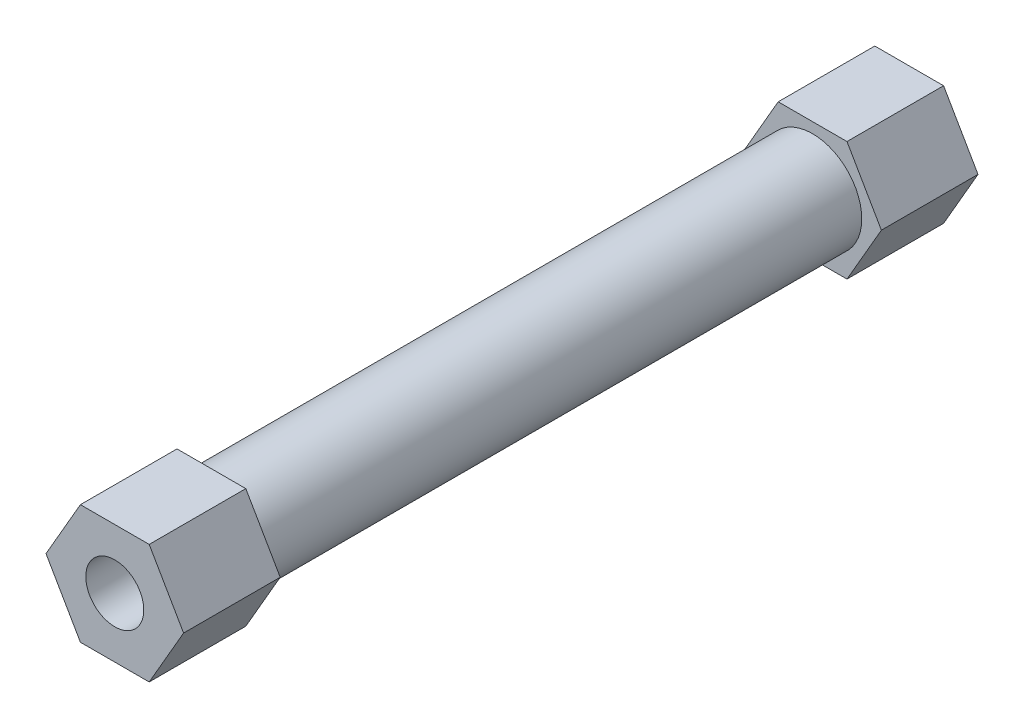
ISO-10303-21;
HEADER;
FILE_DESCRIPTION(('STEP AP214'),'2;1');
FILE_NAME('part.step','',(''),(''),'','','');
FILE_SCHEMA(('AUTOMOTIVE_DESIGN { 1 0 10303 214 1 1 1 1 }'));
ENDSEC;
DATA;
#1=APPLICATION_CONTEXT('core data for automotive mechanical design processes');
#2=APPLICATION_PROTOCOL_DEFINITION('international standard','automotive_design',2000,#1);
#3=PRODUCT_CONTEXT('',#1,'mechanical');
#4=PRODUCT('Part','Part','',(#3));
#5=PRODUCT_RELATED_PRODUCT_CATEGORY('part','',(#4));
#6=PRODUCT_DEFINITION_FORMATION('','',#4);
#7=PRODUCT_DEFINITION_CONTEXT('part definition',#1,'design');
#8=PRODUCT_DEFINITION('design','',#6,#7);
#9=PRODUCT_DEFINITION_SHAPE('','',#8);
#10=(LENGTH_UNIT() NAMED_UNIT(*) SI_UNIT(.MILLI.,.METRE.));
#11=(NAMED_UNIT(*) PLANE_ANGLE_UNIT() SI_UNIT($,.RADIAN.));
#12=(NAMED_UNIT(*) SI_UNIT($,.STERADIAN.) SOLID_ANGLE_UNIT());
#13=UNCERTAINTY_MEASURE_WITH_UNIT(LENGTH_MEASURE(1.E-05),#10,'distance_accuracy_value','');
#14=(GEOMETRIC_REPRESENTATION_CONTEXT(3) GLOBAL_UNCERTAINTY_ASSIGNED_CONTEXT((#13)) GLOBAL_UNIT_ASSIGNED_CONTEXT((#10,
#11,#12)) REPRESENTATION_CONTEXT('',''));
#15=CARTESIAN_POINT('',(0.,0.,0.));
#16=DIRECTION('',(0.,0.,1.));
#17=DIRECTION('',(1.,0.,0.));
#18=AXIS2_PLACEMENT_3D('',#15,#16,#17);
#19=CARTESIAN_POINT('',(-1.60214699700121,-2.775,37.));
#20=DIRECTION('',(0.,1.,0.));
#21=DIRECTION('',(0.,0.,1.));
#22=AXIS2_PLACEMENT_3D('',#19,#20,#21);
#23=PLANE('',#22);
#24=DIRECTION('',(1.,0.,0.));
#25=VECTOR('',#24,1.);
#26=CARTESIAN_POINT('',(-1.60214699700121,-2.775,4.5));
#27=LINE('',#26,#25);
#28=CARTESIAN_POINT('',(-1.60214699700121,-2.775,4.5));
#29=VERTEX_POINT('',#28);
#30=CARTESIAN_POINT('',(1.60214699700121,-2.775,4.5));
#31=VERTEX_POINT('',#30);
#32=EDGE_CURVE('E187',#29,#31,#27,.T.);
#33=ORIENTED_EDGE('',*,*,#32,.F.);
#34=DIRECTION('',(0.,0.,-1.));
#35=VECTOR('',#34,1.);
#36=CARTESIAN_POINT('',(-1.60214699700121,-2.775,37.));
#37=LINE('',#36,#35);
#38=CARTESIAN_POINT('',(-1.60214699700121,-2.775,0.));
#39=VERTEX_POINT('',#38);
#40=EDGE_CURVE('E185',#29,#39,#37,.T.);
#41=ORIENTED_EDGE('',*,*,#40,.T.);
#42=DIRECTION('',(1.,0.,0.));
#43=VECTOR('',#42,1.);
#44=CARTESIAN_POINT('',(-1.60214699700121,-2.775,0.));
#45=LINE('',#44,#43);
#46=CARTESIAN_POINT('',(1.60214699700121,-2.775,0.));
#47=VERTEX_POINT('',#46);
#48=EDGE_CURVE('E179',#39,#47,#45,.T.);
#49=ORIENTED_EDGE('',*,*,#48,.T.);
#50=DIRECTION('',(0.,0.,-1.));
#51=VECTOR('',#50,1.);
#52=CARTESIAN_POINT('',(1.60214699700121,-2.775,37.));
#53=LINE('',#52,#51);
#54=EDGE_CURVE('E157',#31,#47,#53,.T.);
#55=ORIENTED_EDGE('',*,*,#54,.F.);
#56=EDGE_LOOP('',(#33,#41,#49,#55));
#57=FACE_BOUND('',#56,.T.);
#58=ADVANCED_FACE('F33',(#57),#23,.F.);
#59=CARTESIAN_POINT('',(1.60214699700121,-2.775,37.));
#60=DIRECTION('',(-0.866025403784439,0.5,0.));
#61=DIRECTION('',(-0.5,-0.866025403784439,0.));
#62=AXIS2_PLACEMENT_3D('',#59,#60,#61);
#63=PLANE('',#62);
#64=DIRECTION('',(0.5,0.866025403784439,0.));
#65=VECTOR('',#64,1.);
#66=CARTESIAN_POINT('',(1.60214699700121,-2.775,4.5));
#67=LINE('',#66,#65);
#68=CARTESIAN_POINT('',(3.20429399400242,0.,4.5));
#69=VERTEX_POINT('',#68);
#70=EDGE_CURVE('E171',#31,#69,#67,.T.);
#71=ORIENTED_EDGE('',*,*,#70,.F.);
#72=ORIENTED_EDGE('',*,*,#54,.T.);
#73=DIRECTION('',(0.5,0.866025403784439,0.));
#74=VECTOR('',#73,1.);
#75=CARTESIAN_POINT('',(1.60214699700121,-2.775,0.));
#76=LINE('',#75,#74);
#77=CARTESIAN_POINT('',(3.20429399400242,0.,0.));
#78=VERTEX_POINT('',#77);
#79=EDGE_CURVE('E169',#47,#78,#76,.T.);
#80=ORIENTED_EDGE('',*,*,#79,.T.);
#81=DIRECTION('',(0.,0.,-1.));
#82=VECTOR('',#81,1.);
#83=CARTESIAN_POINT('',(3.20429399400242,0.,37.));
#84=LINE('',#83,#82);
#85=EDGE_CURVE('E153',#69,#78,#84,.T.);
#86=ORIENTED_EDGE('',*,*,#85,.F.);
#87=EDGE_LOOP('',(#71,#72,#80,#86));
#88=FACE_BOUND('',#87,.T.);
#89=ADVANCED_FACE('F167',(#88),#63,.F.);
#90=CARTESIAN_POINT('',(3.20429399400242,0.,37.));
#91=DIRECTION('',(-0.866025403784438,-0.5,0.));
#92=DIRECTION('',(0.5,-0.866025403784439,0.));
#93=AXIS2_PLACEMENT_3D('',#90,#91,#92);
#94=PLANE('',#93);
#95=DIRECTION('',(-0.5,0.866025403784439,0.));
#96=VECTOR('',#95,1.);
#97=CARTESIAN_POINT('',(3.20429399400242,0.,4.5));
#98=LINE('',#97,#96);
#99=CARTESIAN_POINT('',(1.60214699700121,2.775,4.5));
#100=VERTEX_POINT('',#99);
#101=EDGE_CURVE('E224',#69,#100,#98,.T.);
#102=ORIENTED_EDGE('',*,*,#101,.F.);
#103=ORIENTED_EDGE('',*,*,#85,.T.);
#104=DIRECTION('',(-0.5,0.866025403784438,0.));
#105=VECTOR('',#104,1.);
#106=CARTESIAN_POINT('',(3.20429399400242,0.,0.));
#107=LINE('',#106,#105);
#108=CARTESIAN_POINT('',(1.60214699700121,2.775,0.));
#109=VERTEX_POINT('',#108);
#110=EDGE_CURVE('E182',#78,#109,#107,.T.);
#111=ORIENTED_EDGE('',*,*,#110,.T.);
#112=DIRECTION('',(0.,0.,-1.));
#113=VECTOR('',#112,1.);
#114=CARTESIAN_POINT('',(1.60214699700121,2.775,37.));
#115=LINE('',#114,#113);
#116=EDGE_CURVE('E149',#100,#109,#115,.T.);
#117=ORIENTED_EDGE('',*,*,#116,.F.);
#118=EDGE_LOOP('',(#102,#103,#111,#117));
#119=FACE_BOUND('',#118,.T.);
#120=ADVANCED_FACE('F230',(#119),#94,.F.);
#121=CARTESIAN_POINT('',(1.60214699700121,2.775,37.));
#122=DIRECTION('',(0.,-1.,0.));
#123=DIRECTION('',(1.,0.,0.));
#124=AXIS2_PLACEMENT_3D('',#121,#122,#123);
#125=PLANE('',#124);
#126=DIRECTION('',(-1.,0.,0.));
#127=VECTOR('',#126,1.);
#128=CARTESIAN_POINT('',(1.60214699700121,2.775,4.5));
#129=LINE('',#128,#127);
#130=CARTESIAN_POINT('',(-1.60214699700121,2.775,4.5));
#131=VERTEX_POINT('',#130);
#132=EDGE_CURVE('E217',#100,#131,#129,.T.);
#133=ORIENTED_EDGE('',*,*,#132,.F.);
#134=ORIENTED_EDGE('',*,*,#116,.T.);
#135=DIRECTION('',(-1.,0.,0.));
#136=VECTOR('',#135,1.);
#137=CARTESIAN_POINT('',(1.60214699700121,2.775,0.));
#138=LINE('',#137,#136);
#139=CARTESIAN_POINT('',(-1.60214699700121,2.775,0.));
#140=VERTEX_POINT('',#139);
#141=EDGE_CURVE('E194',#109,#140,#138,.T.);
#142=ORIENTED_EDGE('',*,*,#141,.T.);
#143=DIRECTION('',(0.,0.,-1.));
#144=VECTOR('',#143,1.);
#145=CARTESIAN_POINT('',(-1.60214699700121,2.775,37.));
#146=LINE('',#145,#144);
#147=EDGE_CURVE('E141',#131,#140,#146,.T.);
#148=ORIENTED_EDGE('',*,*,#147,.F.);
#149=EDGE_LOOP('',(#133,#134,#142,#148));
#150=FACE_BOUND('',#149,.T.);
#151=ADVANCED_FACE('F232',(#150),#125,.F.);
#152=CARTESIAN_POINT('',(-1.60214699700121,2.775,37.));
#153=DIRECTION('',(0.866025403784439,-0.5,0.));
#154=DIRECTION('',(0.5,0.866025403784439,0.));
#155=AXIS2_PLACEMENT_3D('',#152,#153,#154);
#156=PLANE('',#155);
#157=DIRECTION('',(-0.5,-0.866025403784439,0.));
#158=VECTOR('',#157,1.);
#159=CARTESIAN_POINT('',(-1.60214699700121,2.775,4.5));
#160=LINE('',#159,#158);
#161=CARTESIAN_POINT('',(-3.20429399400242,0.,4.5));
#162=VERTEX_POINT('',#161);
#163=EDGE_CURVE('E47',#131,#162,#160,.T.);
#164=ORIENTED_EDGE('',*,*,#163,.F.);
#165=ORIENTED_EDGE('',*,*,#147,.T.);
#166=DIRECTION('',(-0.5,-0.866025403784439,0.));
#167=VECTOR('',#166,1.);
#168=CARTESIAN_POINT('',(-1.60214699700121,2.775,0.));
#169=LINE('',#168,#167);
#170=CARTESIAN_POINT('',(-3.20429399400242,0.,0.));
#171=VERTEX_POINT('',#170);
#172=EDGE_CURVE('E197',#140,#171,#169,.T.);
#173=ORIENTED_EDGE('',*,*,#172,.T.);
#174=DIRECTION('',(0.,0.,-1.));
#175=VECTOR('',#174,1.);
#176=CARTESIAN_POINT('',(-3.20429399400242,0.,37.));
#177=LINE('',#176,#175);
#178=EDGE_CURVE('E142',#162,#171,#177,.T.);
#179=ORIENTED_EDGE('',*,*,#178,.F.);
#180=EDGE_LOOP('',(#164,#165,#173,#179));
#181=FACE_BOUND('',#180,.T.);
#182=ADVANCED_FACE('F237',(#181),#156,.F.);
#183=CARTESIAN_POINT('',(-3.20429399400242,0.,37.));
#184=DIRECTION('',(0.866025403784438,0.5,0.));
#185=DIRECTION('',(-0.5,0.866025403784439,0.));
#186=AXIS2_PLACEMENT_3D('',#183,#184,#185);
#187=PLANE('',#186);
#188=DIRECTION('',(0.5,-0.866025403784439,0.));
#189=VECTOR('',#188,1.);
#190=CARTESIAN_POINT('',(-3.20429399400242,0.,4.5));
#191=LINE('',#190,#189);
#192=EDGE_CURVE('E11',#162,#29,#191,.T.);
#193=ORIENTED_EDGE('',*,*,#192,.F.);
#194=ORIENTED_EDGE('',*,*,#178,.T.);
#195=DIRECTION('',(0.5,-0.866025403784439,0.));
#196=VECTOR('',#195,1.);
#197=CARTESIAN_POINT('',(-3.20429399400242,0.,0.));
#198=LINE('',#197,#196);
#199=EDGE_CURVE('E199',#171,#39,#198,.T.);
#200=ORIENTED_EDGE('',*,*,#199,.T.);
#201=ORIENTED_EDGE('',*,*,#40,.F.);
#202=EDGE_LOOP('',(#193,#194,#200,#201));
#203=FACE_BOUND('',#202,.T.);
#204=ADVANCED_FACE('F238',(#203),#187,.F.);
#205=CARTESIAN_POINT('',(0.,0.,0.));
#206=DIRECTION('',(0.,0.,1.));
#207=DIRECTION('',(1.,0.,0.));
#208=AXIS2_PLACEMENT_3D('',#205,#206,#207);
#209=PLANE('',#208);
#210=CARTESIAN_POINT('',(0.,0.,0.));
#211=DIRECTION('',(0.,0.,-1.));
#212=DIRECTION('',(-1.,0.,0.));
#213=AXIS2_PLACEMENT_3D('',#210,#211,#212);
#214=CIRCLE('',#213,1.35);
#215=CARTESIAN_POINT('',(-1.35,0.,0.));
#216=VERTEX_POINT('',#215);
#217=EDGE_CURVE('E390',#216,#216,#214,.T.);
#218=ORIENTED_EDGE('',*,*,#217,.F.);
#219=EDGE_LOOP('',(#218));
#220=FACE_BOUND('',#219,.T.);
#221=ORIENTED_EDGE('',*,*,#48,.F.);
#222=ORIENTED_EDGE('',*,*,#199,.F.);
#223=ORIENTED_EDGE('',*,*,#172,.F.);
#224=ORIENTED_EDGE('',*,*,#141,.F.);
#225=ORIENTED_EDGE('',*,*,#110,.F.);
#226=ORIENTED_EDGE('',*,*,#79,.F.);
#227=EDGE_LOOP('',(#221,#222,#223,#224,#225,#226));
#228=FACE_BOUND('',#227,.T.);
#229=ADVANCED_FACE('F177',(#220,#228),#209,.F.);
#230=CARTESIAN_POINT('',(0.,0.,4.5));
#231=DIRECTION('',(0.,0.,1.));
#232=DIRECTION('',(1.,0.,0.));
#233=AXIS2_PLACEMENT_3D('',#230,#231,#232);
#234=PLANE('',#233);
#235=CARTESIAN_POINT('',(0.,0.,4.5));
#236=DIRECTION('',(0.,0.,1.));
#237=DIRECTION('',(1.,0.,0.));
#238=AXIS2_PLACEMENT_3D('',#235,#236,#237);
#239=CIRCLE('',#238,2.29);
#240=CARTESIAN_POINT('',(2.29,0.,4.5));
#241=VERTEX_POINT('',#240);
#242=EDGE_CURVE('E137',#241,#241,#239,.T.);
#243=ORIENTED_EDGE('',*,*,#242,.F.);
#244=EDGE_LOOP('',(#243));
#245=FACE_BOUND('',#244,.T.);
#246=ORIENTED_EDGE('',*,*,#32,.T.);
#247=ORIENTED_EDGE('',*,*,#70,.T.);
#248=ORIENTED_EDGE('',*,*,#101,.T.);
#249=ORIENTED_EDGE('',*,*,#132,.T.);
#250=ORIENTED_EDGE('',*,*,#163,.T.);
#251=ORIENTED_EDGE('',*,*,#192,.T.);
#252=EDGE_LOOP('',(#246,#247,#248,#249,#250,#251));
#253=FACE_BOUND('',#252,.T.);
#254=ADVANCED_FACE('F226',(#245,#253),#234,.T.);
#255=CARTESIAN_POINT('',(0.,0.,32.5));
#256=DIRECTION('',(0.,0.,1.));
#257=DIRECTION('',(1.,0.,0.));
#258=AXIS2_PLACEMENT_3D('',#255,#256,#257);
#259=PLANE('',#258);
#260=CARTESIAN_POINT('',(0.,0.,32.5));
#261=DIRECTION('',(0.,0.,1.));
#262=DIRECTION('',(1.,0.,0.));
#263=AXIS2_PLACEMENT_3D('',#260,#261,#262);
#264=CIRCLE('',#263,2.29);
#265=CARTESIAN_POINT('',(2.29,0.,32.5));
#266=VERTEX_POINT('',#265);
#267=EDGE_CURVE('E384',#266,#266,#264,.T.);
#268=ORIENTED_EDGE('',*,*,#267,.T.);
#269=EDGE_LOOP('',(#268));
#270=FACE_BOUND('',#269,.T.);
#271=DIRECTION('',(0.5,-0.866025403784439,0.));
#272=VECTOR('',#271,1.);
#273=CARTESIAN_POINT('',(-3.20429399400242,0.,32.5));
#274=LINE('',#273,#272);
#275=CARTESIAN_POINT('',(-3.20429399400242,0.,32.5));
#276=VERTEX_POINT('',#275);
#277=CARTESIAN_POINT('',(-1.60214699700121,-2.775,32.5));
#278=VERTEX_POINT('',#277);
#279=EDGE_CURVE('E41',#276,#278,#274,.T.);
#280=ORIENTED_EDGE('',*,*,#279,.F.);
#281=DIRECTION('',(-0.5,-0.866025403784439,0.));
#282=VECTOR('',#281,1.);
#283=CARTESIAN_POINT('',(-1.60214699700121,2.775,32.5));
#284=LINE('',#283,#282);
#285=CARTESIAN_POINT('',(-1.60214699700121,2.775,32.5));
#286=VERTEX_POINT('',#285);
#287=EDGE_CURVE('E120',#286,#276,#284,.T.);
#288=ORIENTED_EDGE('',*,*,#287,.F.);
#289=DIRECTION('',(-1.,0.,0.));
#290=VECTOR('',#289,1.);
#291=CARTESIAN_POINT('',(1.60214699700121,2.775,32.5));
#292=LINE('',#291,#290);
#293=CARTESIAN_POINT('',(1.60214699700121,2.775,32.5));
#294=VERTEX_POINT('',#293);
#295=EDGE_CURVE('E136',#294,#286,#292,.T.);
#296=ORIENTED_EDGE('',*,*,#295,.F.);
#297=DIRECTION('',(-0.5,0.866025403784439,0.));
#298=VECTOR('',#297,1.);
#299=CARTESIAN_POINT('',(3.20429399400242,0.,32.5));
#300=LINE('',#299,#298);
#301=CARTESIAN_POINT('',(3.20429399400242,0.,32.5));
#302=VERTEX_POINT('',#301);
#303=EDGE_CURVE('E219',#302,#294,#300,.T.);
#304=ORIENTED_EDGE('',*,*,#303,.F.);
#305=DIRECTION('',(0.5,0.866025403784439,0.));
#306=VECTOR('',#305,1.);
#307=CARTESIAN_POINT('',(1.60214699700121,-2.775,32.5));
#308=LINE('',#307,#306);
#309=CARTESIAN_POINT('',(1.60214699700121,-2.775,32.5));
#310=VERTEX_POINT('',#309);
#311=EDGE_CURVE('E215',#310,#302,#308,.T.);
#312=ORIENTED_EDGE('',*,*,#311,.F.);
#313=DIRECTION('',(1.,0.,0.));
#314=VECTOR('',#313,1.);
#315=CARTESIAN_POINT('',(-1.60214699700121,-2.775,32.5));
#316=LINE('',#315,#314);
#317=EDGE_CURVE('E55',#278,#310,#316,.T.);
#318=ORIENTED_EDGE('',*,*,#317,.F.);
#319=EDGE_LOOP('',(#280,#288,#296,#304,#312,#318));
#320=FACE_BOUND('',#319,.T.);
#321=ADVANCED_FACE('F119',(#270,#320),#259,.F.);
#322=CARTESIAN_POINT('',(0.,0.,4.5));
#323=DIRECTION('',(0.,0.,1.));
#324=DIRECTION('',(1.,0.,0.));
#325=AXIS2_PLACEMENT_3D('',#322,#323,#324);
#326=CYLINDRICAL_SURFACE('',#325,2.29);
#327=ORIENTED_EDGE('',*,*,#242,.T.);
#328=EDGE_LOOP('',(#327));
#329=FACE_BOUND('',#328,.T.);
#330=ORIENTED_EDGE('',*,*,#267,.F.);
#331=EDGE_LOOP('',(#330));
#332=FACE_BOUND('',#331,.T.);
#333=ADVANCED_FACE('F311',(#329,#332),#326,.T.);
#334=CARTESIAN_POINT('',(0.,0.,37.));
#335=DIRECTION('',(0.,0.,1.));
#336=DIRECTION('',(1.,0.,0.));
#337=AXIS2_PLACEMENT_3D('',#334,#335,#336);
#338=PLANE('',#337);
#339=CARTESIAN_POINT('',(0.,0.,37.));
#340=DIRECTION('',(0.,0.,-1.));
#341=DIRECTION('',(-1.,0.,0.));
#342=AXIS2_PLACEMENT_3D('',#339,#340,#341);
#343=CIRCLE('',#342,1.35);
#344=CARTESIAN_POINT('',(-1.35,0.,37.));
#345=VERTEX_POINT('',#344);
#346=EDGE_CURVE('E387',#345,#345,#343,.T.);
#347=ORIENTED_EDGE('',*,*,#346,.T.);
#348=EDGE_LOOP('',(#347));
#349=FACE_BOUND('',#348,.T.);
#350=DIRECTION('',(1.,0.,0.));
#351=VECTOR('',#350,1.);
#352=CARTESIAN_POINT('',(-1.60214699700121,-2.775,37.));
#353=LINE('',#352,#351);
#354=CARTESIAN_POINT('',(-1.60214699700121,-2.775,37.));
#355=VERTEX_POINT('',#354);
#356=CARTESIAN_POINT('',(1.60214699700121,-2.775,37.));
#357=VERTEX_POINT('',#356);
#358=EDGE_CURVE('E200',#355,#357,#353,.T.);
#359=ORIENTED_EDGE('',*,*,#358,.T.);
#360=DIRECTION('',(0.5,0.866025403784439,0.));
#361=VECTOR('',#360,1.);
#362=CARTESIAN_POINT('',(1.60214699700121,-2.775,37.));
#363=LINE('',#362,#361);
#364=CARTESIAN_POINT('',(3.20429399400242,0.,37.));
#365=VERTEX_POINT('',#364);
#366=EDGE_CURVE('E203',#357,#365,#363,.T.);
#367=ORIENTED_EDGE('',*,*,#366,.T.);
#368=DIRECTION('',(-0.5,0.866025403784438,0.));
#369=VECTOR('',#368,1.);
#370=CARTESIAN_POINT('',(3.20429399400242,0.,37.));
#371=LINE('',#370,#369);
#372=CARTESIAN_POINT('',(1.60214699700121,2.775,37.));
#373=VERTEX_POINT('',#372);
#374=EDGE_CURVE('E207',#365,#373,#371,.T.);
#375=ORIENTED_EDGE('',*,*,#374,.T.);
#376=DIRECTION('',(-1.,0.,0.));
#377=VECTOR('',#376,1.);
#378=CARTESIAN_POINT('',(1.60214699700121,2.775,37.));
#379=LINE('',#378,#377);
#380=CARTESIAN_POINT('',(-1.60214699700121,2.775,37.));
#381=VERTEX_POINT('',#380);
#382=EDGE_CURVE('E212',#373,#381,#379,.T.);
#383=ORIENTED_EDGE('',*,*,#382,.T.);
#384=DIRECTION('',(-0.5,-0.866025403784439,0.));
#385=VECTOR('',#384,1.);
#386=CARTESIAN_POINT('',(-1.60214699700121,2.775,37.));
#387=LINE('',#386,#385);
#388=CARTESIAN_POINT('',(-3.20429399400242,0.,37.));
#389=VERTEX_POINT('',#388);
#390=EDGE_CURVE('E213',#381,#389,#387,.T.);
#391=ORIENTED_EDGE('',*,*,#390,.T.);
#392=DIRECTION('',(0.5,-0.866025403784439,0.));
#393=VECTOR('',#392,1.);
#394=CARTESIAN_POINT('',(-3.20429399400242,0.,37.));
#395=LINE('',#394,#393);
#396=EDGE_CURVE('E140',#389,#355,#395,.T.);
#397=ORIENTED_EDGE('',*,*,#396,.T.);
#398=EDGE_LOOP('',(#359,#367,#375,#383,#391,#397));
#399=FACE_BOUND('',#398,.T.);
#400=ADVANCED_FACE('F249',(#349,#399),#338,.T.);
#401=EDGE_CURVE('E132',#389,#276,#177,.T.);
#402=ORIENTED_EDGE('',*,*,#401,.T.);
#403=ORIENTED_EDGE('',*,*,#279,.T.);
#404=EDGE_CURVE('E145',#355,#278,#37,.T.);
#405=ORIENTED_EDGE('',*,*,#404,.F.);
#406=ORIENTED_EDGE('',*,*,#396,.F.);
#407=EDGE_LOOP('',(#402,#403,#405,#406));
#408=FACE_BOUND('',#407,.T.);
#409=ADVANCED_FACE('F139',(#408),#187,.F.);
#410=EDGE_CURVE('E135',#381,#286,#146,.T.);
#411=ORIENTED_EDGE('',*,*,#410,.T.);
#412=ORIENTED_EDGE('',*,*,#287,.T.);
#413=ORIENTED_EDGE('',*,*,#401,.F.);
#414=ORIENTED_EDGE('',*,*,#390,.F.);
#415=EDGE_LOOP('',(#411,#412,#413,#414));
#416=FACE_BOUND('',#415,.T.);
#417=ADVANCED_FACE('F130',(#416),#156,.F.);
#418=EDGE_CURVE('E150',#373,#294,#115,.T.);
#419=ORIENTED_EDGE('',*,*,#418,.T.);
#420=ORIENTED_EDGE('',*,*,#295,.T.);
#421=ORIENTED_EDGE('',*,*,#410,.F.);
#422=ORIENTED_EDGE('',*,*,#382,.F.);
#423=EDGE_LOOP('',(#419,#420,#421,#422));
#424=FACE_BOUND('',#423,.T.);
#425=ADVANCED_FACE('F267',(#424),#125,.F.);
#426=EDGE_CURVE('E154',#365,#302,#84,.T.);
#427=ORIENTED_EDGE('',*,*,#426,.T.);
#428=ORIENTED_EDGE('',*,*,#303,.T.);
#429=ORIENTED_EDGE('',*,*,#418,.F.);
#430=ORIENTED_EDGE('',*,*,#374,.F.);
#431=EDGE_LOOP('',(#427,#428,#429,#430));
#432=FACE_BOUND('',#431,.T.);
#433=ADVANCED_FACE('F263',(#432),#94,.F.);
#434=EDGE_CURVE('E126',#357,#310,#53,.T.);
#435=ORIENTED_EDGE('',*,*,#434,.T.);
#436=ORIENTED_EDGE('',*,*,#311,.T.);
#437=ORIENTED_EDGE('',*,*,#426,.F.);
#438=ORIENTED_EDGE('',*,*,#366,.F.);
#439=EDGE_LOOP('',(#435,#436,#437,#438));
#440=FACE_BOUND('',#439,.T.);
#441=ADVANCED_FACE('F254',(#440),#63,.F.);
#442=ORIENTED_EDGE('',*,*,#404,.T.);
#443=ORIENTED_EDGE('',*,*,#317,.T.);
#444=ORIENTED_EDGE('',*,*,#434,.F.);
#445=ORIENTED_EDGE('',*,*,#358,.F.);
#446=EDGE_LOOP('',(#442,#443,#444,#445));
#447=FACE_BOUND('',#446,.T.);
#448=ADVANCED_FACE('F35',(#447),#23,.F.);
#449=CARTESIAN_POINT('',(0.,0.,37.));
#450=DIRECTION('',(0.,0.,-1.));
#451=DIRECTION('',(-1.,0.,0.));
#452=AXIS2_PLACEMENT_3D('',#449,#450,#451);
#453=CYLINDRICAL_SURFACE('',#452,1.35);
#454=ORIENTED_EDGE('',*,*,#346,.F.);
#455=EDGE_LOOP('',(#454));
#456=FACE_BOUND('',#455,.T.);
#457=ORIENTED_EDGE('',*,*,#217,.T.);
#458=EDGE_LOOP('',(#457));
#459=FACE_BOUND('',#458,.T.);
#460=ADVANCED_FACE('F256',(#456,#459),#453,.F.);
#461=CLOSED_SHELL('',(#58,#89,#120,#151,#182,#204,#229,#254,#321,#333,#400,#409,#417,#425,#433,
#441,#448,#460));
#462=MANIFOLD_SOLID_BREP('B2',#461);
#463=ADVANCED_BREP_SHAPE_REPRESENTATION('',(#18,#462),#14);
#464=SHAPE_DEFINITION_REPRESENTATION(#9,#463);
ENDSEC;
END-ISO-10303-21;
